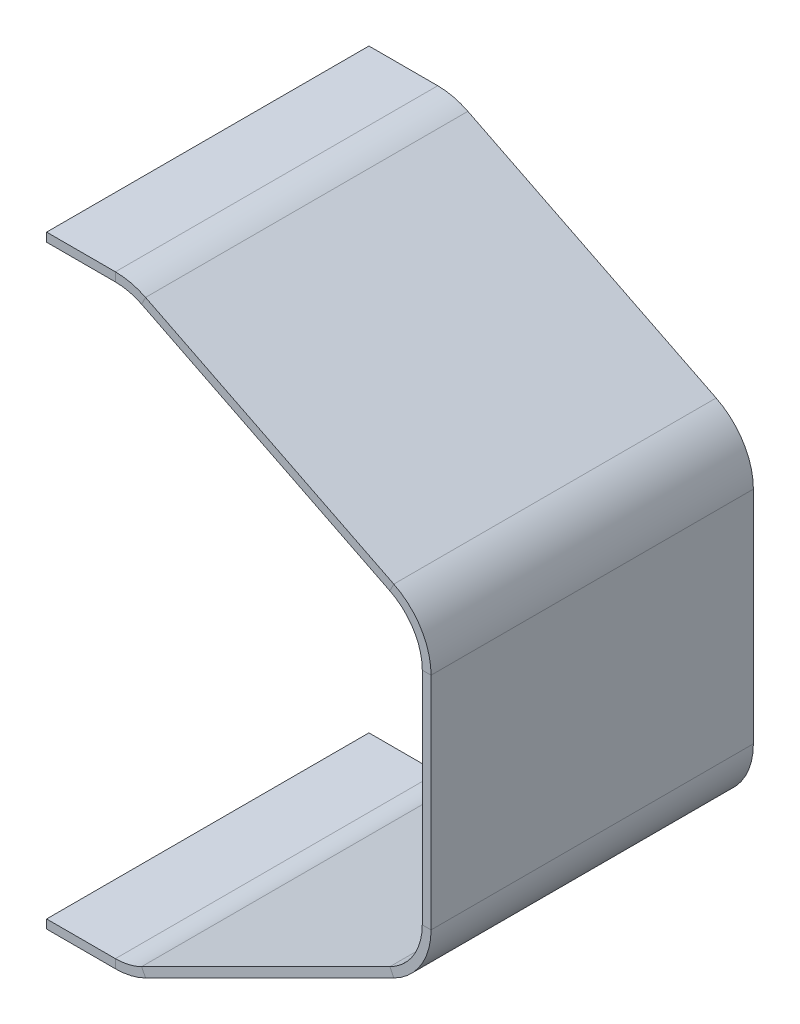
ISO-10303-21;
HEADER;
FILE_DESCRIPTION(('STEP AP214'),'2;1');
FILE_NAME('part.step','',(''),(''),'','','');
FILE_SCHEMA(('AUTOMOTIVE_DESIGN { 1 0 10303 214 1 1 1 1 }'));
ENDSEC;
DATA;
#1=APPLICATION_CONTEXT('core data for automotive mechanical design processes');
#2=APPLICATION_PROTOCOL_DEFINITION('international standard','automotive_design',2000,#1);
#3=PRODUCT_CONTEXT('',#1,'mechanical');
#4=PRODUCT('Part','Part','',(#3));
#5=PRODUCT_RELATED_PRODUCT_CATEGORY('part','',(#4));
#6=PRODUCT_DEFINITION_FORMATION('','',#4);
#7=PRODUCT_DEFINITION_CONTEXT('part definition',#1,'design');
#8=PRODUCT_DEFINITION('design','',#6,#7);
#9=PRODUCT_DEFINITION_SHAPE('','',#8);
#10=(LENGTH_UNIT() NAMED_UNIT(*) SI_UNIT(.MILLI.,.METRE.));
#11=(NAMED_UNIT(*) PLANE_ANGLE_UNIT() SI_UNIT($,.RADIAN.));
#12=(NAMED_UNIT(*) SI_UNIT($,.STERADIAN.) SOLID_ANGLE_UNIT());
#13=UNCERTAINTY_MEASURE_WITH_UNIT(LENGTH_MEASURE(1.E-05),#10,'distance_accuracy_value','');
#14=(GEOMETRIC_REPRESENTATION_CONTEXT(3) GLOBAL_UNCERTAINTY_ASSIGNED_CONTEXT((#13)) GLOBAL_UNIT_ASSIGNED_CONTEXT((#10,
#11,#12)) REPRESENTATION_CONTEXT('',''));
#15=CARTESIAN_POINT('',(0.,0.,0.));
#16=DIRECTION('',(0.,0.,1.));
#17=DIRECTION('',(1.,0.,0.));
#18=AXIS2_PLACEMENT_3D('',#15,#16,#17);
#19=CARTESIAN_POINT('',(16.2114561800017,-48.9442719099992,55.));
#20=DIRECTION('',(0.,0.,1.));
#21=DIRECTION('',(1.,0.,0.));
#22=AXIS2_PLACEMENT_3D('',#19,#20,#21);
#23=PLANE('',#22);
#24=DIRECTION('',(0.447213595499958,-0.894427190999916,0.));
#25=VECTOR('',#24,1.);
#26=CARTESIAN_POINT('',(16.2114561800017,-48.9442719099992,55.));
#27=LINE('',#26,#25);
#28=CARTESIAN_POINT('',(16.2114561800017,-48.9442719099992,55.));
#29=VERTEX_POINT('',#28);
#30=CARTESIAN_POINT('',(16.8822765732516,-50.285912696499,55.));
#31=VERTEX_POINT('',#30);
#32=EDGE_CURVE('E11',#29,#31,#27,.T.);
#33=ORIENTED_EDGE('',*,*,#32,.F.);
#34=CARTESIAN_POINT('',(11.7393202250021,-40.,55.));
#35=DIRECTION('',(0.,0.,1.));
#36=DIRECTION('',(1.,0.,0.));
#37=AXIS2_PLACEMENT_3D('',#34,#35,#36);
#38=CIRCLE('',#37,10.);
#39=CARTESIAN_POINT('',(11.7393202250021,-50.,55.));
#40=VERTEX_POINT('',#39);
#41=EDGE_CURVE('E363',#40,#29,#38,.T.);
#42=ORIENTED_EDGE('',*,*,#41,.F.);
#43=DIRECTION('',(0.,1.,0.));
#44=VECTOR('',#43,1.);
#45=CARTESIAN_POINT('',(11.7393202250021,-51.5,55.));
#46=LINE('',#45,#44);
#47=CARTESIAN_POINT('',(11.7393202250021,-51.5,55.));
#48=VERTEX_POINT('',#47);
#49=EDGE_CURVE('E42',#48,#40,#46,.T.);
#50=ORIENTED_EDGE('',*,*,#49,.F.);
#51=CARTESIAN_POINT('',(11.7393202250021,-40.,55.));
#52=DIRECTION('',(0.,0.,1.));
#53=DIRECTION('',(1.,0.,0.));
#54=AXIS2_PLACEMENT_3D('',#51,#52,#53);
#55=CIRCLE('',#54,11.5);
#56=EDGE_CURVE('E376',#48,#31,#55,.T.);
#57=ORIENTED_EDGE('',*,*,#56,.T.);
#58=EDGE_LOOP('',(#33,#42,#50,#57));
#59=FACE_BOUND('',#58,.T.);
#60=ADVANCED_FACE('F34',(#59),#23,.T.);
#61=CARTESIAN_POINT('',(11.7393202250021,-51.5,55.));
#62=DIRECTION('',(0.,0.,1.));
#63=DIRECTION('',(1.,0.,0.));
#64=AXIS2_PLACEMENT_3D('',#61,#62,#63);
#65=PLANE('',#64);
#66=DIRECTION('',(0.894427190999916,0.447213595499958,0.));
#67=VECTOR('',#66,1.);
#68=CARTESIAN_POINT('',(58.5721359549996,-27.7639320225002,55.));
#69=LINE('',#68,#67);
#70=CARTESIAN_POINT('',(58.5721359549996,-27.7639320225002,55.));
#71=VERTEX_POINT('',#70);
#72=EDGE_CURVE('E367',#29,#71,#69,.T.);
#73=ORIENTED_EDGE('',*,*,#72,.F.);
#74=ORIENTED_EDGE('',*,*,#32,.T.);
#75=DIRECTION('',(0.894427190999916,0.447213595499958,0.));
#76=VECTOR('',#75,1.);
#77=CARTESIAN_POINT('',(59.2429563482495,-29.1055728090001,55.));
#78=LINE('',#77,#76);
#79=CARTESIAN_POINT('',(59.2429563482495,-29.1055728090001,55.));
#80=VERTEX_POINT('',#79);
#81=EDGE_CURVE('E378',#31,#80,#78,.T.);
#82=ORIENTED_EDGE('',*,*,#81,.T.);
#83=DIRECTION('',(-0.447213595499958,0.894427190999916,0.));
#84=VECTOR('',#83,1.);
#85=CARTESIAN_POINT('',(59.2429563482495,-29.1055728090001,55.));
#86=LINE('',#85,#84);
#87=EDGE_CURVE('E337',#80,#71,#86,.T.);
#88=ORIENTED_EDGE('',*,*,#87,.T.);
#89=EDGE_LOOP('',(#73,#74,#82,#88));
#90=FACE_BOUND('',#89,.T.);
#91=ADVANCED_FACE('F447',(#90),#65,.T.);
#92=CARTESIAN_POINT('',(11.7393202250021,-50.,0.));
#93=DIRECTION('',(0.,0.,-1.));
#94=DIRECTION('',(-1.,0.,0.));
#95=AXIS2_PLACEMENT_3D('',#92,#93,#94);
#96=PLANE('',#95);
#97=DIRECTION('',(0.,-1.,0.));
#98=VECTOR('',#97,1.);
#99=CARTESIAN_POINT('',(11.7393202250021,-50.,0.));
#100=LINE('',#99,#98);
#101=CARTESIAN_POINT('',(11.7393202250021,-50.,0.));
#102=VERTEX_POINT('',#101);
#103=CARTESIAN_POINT('',(11.7393202250021,-51.5,0.));
#104=VERTEX_POINT('',#103);
#105=EDGE_CURVE('E343',#102,#104,#100,.T.);
#106=ORIENTED_EDGE('',*,*,#105,.F.);
#107=CARTESIAN_POINT('',(11.7393202250021,-40.,0.));
#108=DIRECTION('',(0.,0.,1.));
#109=DIRECTION('',(1.,0.,0.));
#110=AXIS2_PLACEMENT_3D('',#107,#108,#109);
#111=CIRCLE('',#110,10.);
#112=CARTESIAN_POINT('',(16.2114561800017,-48.9442719099992,0.));
#113=VERTEX_POINT('',#112);
#114=EDGE_CURVE('E247',#102,#113,#111,.T.);
#115=ORIENTED_EDGE('',*,*,#114,.T.);
#116=DIRECTION('',(-0.447213595499958,0.894427190999916,0.));
#117=VECTOR('',#116,1.);
#118=CARTESIAN_POINT('',(16.8822765732516,-50.285912696499,0.));
#119=LINE('',#118,#117);
#120=CARTESIAN_POINT('',(16.8822765732516,-50.285912696499,0.));
#121=VERTEX_POINT('',#120);
#122=EDGE_CURVE('E341',#121,#113,#119,.T.);
#123=ORIENTED_EDGE('',*,*,#122,.F.);
#124=CARTESIAN_POINT('',(11.7393202250021,-40.,0.));
#125=DIRECTION('',(0.,0.,1.));
#126=DIRECTION('',(1.,0.,0.));
#127=AXIS2_PLACEMENT_3D('',#124,#125,#126);
#128=CIRCLE('',#127,11.5);
#129=EDGE_CURVE('E259',#104,#121,#128,.T.);
#130=ORIENTED_EDGE('',*,*,#129,.F.);
#131=EDGE_LOOP('',(#106,#115,#123,#130));
#132=FACE_BOUND('',#131,.T.);
#133=ADVANCED_FACE('F489',(#132),#96,.T.);
#134=CARTESIAN_POINT('',(16.8822765732516,-50.285912696499,0.));
#135=DIRECTION('',(0.,0.,-1.));
#136=DIRECTION('',(-1.,0.,0.));
#137=AXIS2_PLACEMENT_3D('',#134,#135,#136);
#138=PLANE('',#137);
#139=DIRECTION('',(1.,0.,0.));
#140=VECTOR('',#139,1.);
#141=CARTESIAN_POINT('',(11.7393202250021,-50.,0.));
#142=LINE('',#141,#140);
#143=CARTESIAN_POINT('',(0.,-50.,0.));
#144=VERTEX_POINT('',#143);
#145=EDGE_CURVE('E250',#144,#102,#142,.T.);
#146=ORIENTED_EDGE('',*,*,#145,.T.);
#147=ORIENTED_EDGE('',*,*,#105,.T.);
#148=DIRECTION('',(1.,0.,0.));
#149=VECTOR('',#148,1.);
#150=CARTESIAN_POINT('',(11.7393202250021,-51.5,0.));
#151=LINE('',#150,#149);
#152=CARTESIAN_POINT('',(0.,-51.5,0.));
#153=VERTEX_POINT('',#152);
#154=EDGE_CURVE('E256',#153,#104,#151,.T.);
#155=ORIENTED_EDGE('',*,*,#154,.F.);
#156=DIRECTION('',(0.,1.,0.));
#157=VECTOR('',#156,1.);
#158=CARTESIAN_POINT('',(0.,-51.5,0.));
#159=LINE('',#158,#157);
#160=EDGE_CURVE('E253',#153,#144,#159,.T.);
#161=ORIENTED_EDGE('',*,*,#160,.T.);
#162=EDGE_LOOP('',(#146,#147,#155,#161));
#163=FACE_BOUND('',#162,.T.);
#164=ADVANCED_FACE('F493',(#163),#138,.T.);
#165=CARTESIAN_POINT('',(64.1,-18.8196601125011,55.));
#166=DIRECTION('',(0.,0.,1.));
#167=DIRECTION('',(1.,0.,0.));
#168=AXIS2_PLACEMENT_3D('',#165,#166,#167);
#169=PLANE('',#168);
#170=DIRECTION('',(1.,0.,0.));
#171=VECTOR('',#170,1.);
#172=CARTESIAN_POINT('',(64.1,-18.8196601125011,55.));
#173=LINE('',#172,#171);
#174=CARTESIAN_POINT('',(64.1,-18.8196601125011,55.));
#175=VERTEX_POINT('',#174);
#176=CARTESIAN_POINT('',(65.6,-18.8196601125011,55.));
#177=VERTEX_POINT('',#176);
#178=EDGE_CURVE('E339',#175,#177,#173,.T.);
#179=ORIENTED_EDGE('',*,*,#178,.F.);
#180=CARTESIAN_POINT('',(54.1,-18.8196601125011,55.));
#181=DIRECTION('',(0.,0.,1.));
#182=DIRECTION('',(1.,0.,0.));
#183=AXIS2_PLACEMENT_3D('',#180,#181,#182);
#184=CIRCLE('',#183,10.);
#185=EDGE_CURVE('E437',#71,#175,#184,.T.);
#186=ORIENTED_EDGE('',*,*,#185,.F.);
#187=ORIENTED_EDGE('',*,*,#87,.F.);
#188=CARTESIAN_POINT('',(54.1,-18.8196601125011,55.));
#189=DIRECTION('',(0.,0.,1.));
#190=DIRECTION('',(1.,0.,0.));
#191=AXIS2_PLACEMENT_3D('',#188,#189,#190);
#192=CIRCLE('',#191,11.5);
#193=EDGE_CURVE('E381',#80,#177,#192,.T.);
#194=ORIENTED_EDGE('',*,*,#193,.T.);
#195=EDGE_LOOP('',(#179,#186,#187,#194));
#196=FACE_BOUND('',#195,.T.);
#197=ADVANCED_FACE('F454',(#196),#169,.T.);
#198=CARTESIAN_POINT('',(59.2429563482495,-29.1055728090001,55.));
#199=DIRECTION('',(0.,0.,1.));
#200=DIRECTION('',(1.,0.,0.));
#201=AXIS2_PLACEMENT_3D('',#198,#199,#200);
#202=PLANE('',#201);
#203=DIRECTION('',(0.,1.,0.));
#204=VECTOR('',#203,1.);
#205=CARTESIAN_POINT('',(64.1,-18.8196601125011,55.));
#206=LINE('',#205,#204);
#207=CARTESIAN_POINT('',(64.1,18.8196601125011,55.));
#208=VERTEX_POINT('',#207);
#209=EDGE_CURVE('E434',#175,#208,#206,.T.);
#210=ORIENTED_EDGE('',*,*,#209,.F.);
#211=ORIENTED_EDGE('',*,*,#178,.T.);
#212=DIRECTION('',(0.,1.,0.));
#213=VECTOR('',#212,1.);
#214=CARTESIAN_POINT('',(65.6,-18.8196601125011,55.));
#215=LINE('',#214,#213);
#216=CARTESIAN_POINT('',(65.6,18.8196601125011,55.));
#217=VERTEX_POINT('',#216);
#218=EDGE_CURVE('E201',#177,#217,#215,.T.);
#219=ORIENTED_EDGE('',*,*,#218,.T.);
#220=DIRECTION('',(-1.,0.,0.));
#221=VECTOR('',#220,1.);
#222=CARTESIAN_POINT('',(65.6,18.8196601125011,55.));
#223=LINE('',#222,#221);
#224=EDGE_CURVE('E192',#217,#208,#223,.T.);
#225=ORIENTED_EDGE('',*,*,#224,.T.);
#226=EDGE_LOOP('',(#210,#211,#219,#225));
#227=FACE_BOUND('',#226,.T.);
#228=ADVANCED_FACE('F387',(#227),#202,.T.);
#229=CARTESIAN_POINT('',(58.5721359549996,-27.7639320225002,0.));
#230=DIRECTION('',(0.,0.,-1.));
#231=DIRECTION('',(-1.,0.,0.));
#232=AXIS2_PLACEMENT_3D('',#229,#230,#231);
#233=PLANE('',#232);
#234=DIRECTION('',(0.447213595499958,-0.894427190999916,0.));
#235=VECTOR('',#234,1.);
#236=CARTESIAN_POINT('',(58.5721359549996,-27.7639320225002,0.));
#237=LINE('',#236,#235);
#238=CARTESIAN_POINT('',(58.5721359549996,-27.7639320225002,0.));
#239=VERTEX_POINT('',#238);
#240=CARTESIAN_POINT('',(59.2429563482495,-29.1055728090001,0.));
#241=VERTEX_POINT('',#240);
#242=EDGE_CURVE('E335',#239,#241,#237,.T.);
#243=ORIENTED_EDGE('',*,*,#242,.F.);
#244=CARTESIAN_POINT('',(54.1,-18.8196601125011,0.));
#245=DIRECTION('',(0.,0.,1.));
#246=DIRECTION('',(1.,0.,0.));
#247=AXIS2_PLACEMENT_3D('',#244,#245,#246);
#248=CIRCLE('',#247,10.);
#249=CARTESIAN_POINT('',(64.1,-18.8196601125011,0.));
#250=VERTEX_POINT('',#249);
#251=EDGE_CURVE('E241',#239,#250,#248,.T.);
#252=ORIENTED_EDGE('',*,*,#251,.T.);
#253=DIRECTION('',(-1.,0.,0.));
#254=VECTOR('',#253,1.);
#255=CARTESIAN_POINT('',(65.6,-18.8196601125011,0.));
#256=LINE('',#255,#254);
#257=CARTESIAN_POINT('',(65.6,-18.8196601125011,0.));
#258=VERTEX_POINT('',#257);
#259=EDGE_CURVE('E191',#258,#250,#256,.T.);
#260=ORIENTED_EDGE('',*,*,#259,.F.);
#261=CARTESIAN_POINT('',(54.1,-18.8196601125011,0.));
#262=DIRECTION('',(0.,0.,1.));
#263=DIRECTION('',(1.,0.,0.));
#264=AXIS2_PLACEMENT_3D('',#261,#262,#263);
#265=CIRCLE('',#264,11.5);
#266=EDGE_CURVE('E265',#241,#258,#265,.T.);
#267=ORIENTED_EDGE('',*,*,#266,.F.);
#268=EDGE_LOOP('',(#243,#252,#260,#267));
#269=FACE_BOUND('',#268,.T.);
#270=ADVANCED_FACE('F463',(#269),#233,.T.);
#271=CARTESIAN_POINT('',(65.6,-18.8196601125011,0.));
#272=DIRECTION('',(0.,0.,-1.));
#273=DIRECTION('',(-1.,0.,0.));
#274=AXIS2_PLACEMENT_3D('',#271,#272,#273);
#275=PLANE('',#274);
#276=DIRECTION('',(0.894427190999916,0.447213595499958,0.));
#277=VECTOR('',#276,1.);
#278=CARTESIAN_POINT('',(58.5721359549996,-27.7639320225002,0.));
#279=LINE('',#278,#277);
#280=EDGE_CURVE('E244',#113,#239,#279,.T.);
#281=ORIENTED_EDGE('',*,*,#280,.T.);
#282=ORIENTED_EDGE('',*,*,#242,.T.);
#283=DIRECTION('',(0.894427190999916,0.447213595499958,0.));
#284=VECTOR('',#283,1.);
#285=CARTESIAN_POINT('',(59.2429563482495,-29.1055728090001,0.));
#286=LINE('',#285,#284);
#287=EDGE_CURVE('E262',#121,#241,#286,.T.);
#288=ORIENTED_EDGE('',*,*,#287,.F.);
#289=ORIENTED_EDGE('',*,*,#122,.T.);
#290=EDGE_LOOP('',(#281,#282,#288,#289));
#291=FACE_BOUND('',#290,.T.);
#292=ADVANCED_FACE('F467',(#291),#275,.T.);
#293=CARTESIAN_POINT('',(58.5721359549996,27.7639320225002,55.));
#294=DIRECTION('',(0.,0.,1.));
#295=DIRECTION('',(1.,0.,0.));
#296=AXIS2_PLACEMENT_3D('',#293,#294,#295);
#297=PLANE('',#296);
#298=DIRECTION('',(0.447213595499956,0.894427190999917,0.));
#299=VECTOR('',#298,1.);
#300=CARTESIAN_POINT('',(58.5721359549996,27.7639320225002,55.));
#301=LINE('',#300,#299);
#302=CARTESIAN_POINT('',(58.5721359549996,27.7639320225002,55.));
#303=VERTEX_POINT('',#302);
#304=CARTESIAN_POINT('',(59.2429563482495,29.1055728090001,55.));
#305=VERTEX_POINT('',#304);
#306=EDGE_CURVE('E179',#303,#305,#301,.T.);
#307=ORIENTED_EDGE('',*,*,#306,.F.);
#308=CARTESIAN_POINT('',(54.1,18.8196601125011,55.));
#309=DIRECTION('',(0.,0.,1.));
#310=DIRECTION('',(1.,0.,0.));
#311=AXIS2_PLACEMENT_3D('',#308,#309,#310);
#312=CIRCLE('',#311,10.);
#313=EDGE_CURVE('E399',#208,#303,#312,.T.);
#314=ORIENTED_EDGE('',*,*,#313,.F.);
#315=ORIENTED_EDGE('',*,*,#224,.F.);
#316=CARTESIAN_POINT('',(54.1,18.8196601125011,55.));
#317=DIRECTION('',(0.,0.,1.));
#318=DIRECTION('',(1.,0.,0.));
#319=AXIS2_PLACEMENT_3D('',#316,#317,#318);
#320=CIRCLE('',#319,11.5);
#321=EDGE_CURVE('E195',#217,#305,#320,.T.);
#322=ORIENTED_EDGE('',*,*,#321,.T.);
#323=EDGE_LOOP('',(#307,#314,#315,#322));
#324=FACE_BOUND('',#323,.T.);
#325=ADVANCED_FACE('F197',(#324),#297,.T.);
#326=CARTESIAN_POINT('',(65.6,18.8196601125011,55.));
#327=DIRECTION('',(0.,0.,1.));
#328=DIRECTION('',(1.,0.,0.));
#329=AXIS2_PLACEMENT_3D('',#326,#327,#328);
#330=PLANE('',#329);
#331=DIRECTION('',(-0.894427190999916,0.447213595499958,0.));
#332=VECTOR('',#331,1.);
#333=CARTESIAN_POINT('',(58.5721359549996,27.7639320225002,55.));
#334=LINE('',#333,#332);
#335=CARTESIAN_POINT('',(16.2114561800017,48.9442719099992,55.));
#336=VERTEX_POINT('',#335);
#337=EDGE_CURVE('E186',#303,#336,#334,.T.);
#338=ORIENTED_EDGE('',*,*,#337,.F.);
#339=ORIENTED_EDGE('',*,*,#306,.T.);
#340=DIRECTION('',(-0.894427190999916,0.447213595499958,0.));
#341=VECTOR('',#340,1.);
#342=CARTESIAN_POINT('',(59.2429563482495,29.1055728090001,55.));
#343=LINE('',#342,#341);
#344=CARTESIAN_POINT('',(16.8822765732516,50.285912696499,55.));
#345=VERTEX_POINT('',#344);
#346=EDGE_CURVE('E183',#305,#345,#343,.T.);
#347=ORIENTED_EDGE('',*,*,#346,.T.);
#348=DIRECTION('',(-0.44721359549996,-0.894427190999915,0.));
#349=VECTOR('',#348,1.);
#350=CARTESIAN_POINT('',(16.8822765732516,50.285912696499,55.));
#351=LINE('',#350,#349);
#352=EDGE_CURVE('E326',#345,#336,#351,.T.);
#353=ORIENTED_EDGE('',*,*,#352,.T.);
#354=EDGE_LOOP('',(#338,#339,#347,#353));
#355=FACE_BOUND('',#354,.T.);
#356=ADVANCED_FACE('F181',(#355),#330,.T.);
#357=CARTESIAN_POINT('',(64.1,18.8196601125011,0.));
#358=DIRECTION('',(0.,0.,-1.));
#359=DIRECTION('',(-1.,0.,0.));
#360=AXIS2_PLACEMENT_3D('',#357,#358,#359);
#361=PLANE('',#360);
#362=DIRECTION('',(1.,0.,0.));
#363=VECTOR('',#362,1.);
#364=CARTESIAN_POINT('',(64.1,18.8196601125011,0.));
#365=LINE('',#364,#363);
#366=CARTESIAN_POINT('',(64.1,18.8196601125011,0.));
#367=VERTEX_POINT('',#366);
#368=CARTESIAN_POINT('',(65.6,18.8196601125011,0.));
#369=VERTEX_POINT('',#368);
#370=EDGE_CURVE('E331',#367,#369,#365,.T.);
#371=ORIENTED_EDGE('',*,*,#370,.F.);
#372=CARTESIAN_POINT('',(54.1,18.8196601125011,0.));
#373=DIRECTION('',(0.,0.,1.));
#374=DIRECTION('',(1.,0.,0.));
#375=AXIS2_PLACEMENT_3D('',#372,#373,#374);
#376=CIRCLE('',#375,10.);
#377=CARTESIAN_POINT('',(58.5721359549996,27.7639320225002,0.));
#378=VERTEX_POINT('',#377);
#379=EDGE_CURVE('E235',#367,#378,#376,.T.);
#380=ORIENTED_EDGE('',*,*,#379,.T.);
#381=DIRECTION('',(-0.447213595499956,-0.894427190999917,0.));
#382=VECTOR('',#381,1.);
#383=CARTESIAN_POINT('',(59.2429563482495,29.1055728090001,0.));
#384=LINE('',#383,#382);
#385=CARTESIAN_POINT('',(59.2429563482495,29.1055728090001,0.));
#386=VERTEX_POINT('',#385);
#387=EDGE_CURVE('E329',#386,#378,#384,.T.);
#388=ORIENTED_EDGE('',*,*,#387,.F.);
#389=CARTESIAN_POINT('',(54.1,18.8196601125011,0.));
#390=DIRECTION('',(0.,0.,1.));
#391=DIRECTION('',(1.,0.,0.));
#392=AXIS2_PLACEMENT_3D('',#389,#390,#391);
#393=CIRCLE('',#392,11.5);
#394=EDGE_CURVE('E208',#369,#386,#393,.T.);
#395=ORIENTED_EDGE('',*,*,#394,.F.);
#396=EDGE_LOOP('',(#371,#380,#388,#395));
#397=FACE_BOUND('',#396,.T.);
#398=ADVANCED_FACE('F393',(#397),#361,.T.);
#399=CARTESIAN_POINT('',(59.2429563482495,29.1055728090001,0.));
#400=DIRECTION('',(0.,0.,-1.));
#401=DIRECTION('',(-1.,0.,0.));
#402=AXIS2_PLACEMENT_3D('',#399,#400,#401);
#403=PLANE('',#402);
#404=DIRECTION('',(0.,1.,0.));
#405=VECTOR('',#404,1.);
#406=CARTESIAN_POINT('',(64.1,-18.8196601125011,0.));
#407=LINE('',#406,#405);
#408=EDGE_CURVE('E238',#250,#367,#407,.T.);
#409=ORIENTED_EDGE('',*,*,#408,.T.);
#410=ORIENTED_EDGE('',*,*,#370,.T.);
#411=DIRECTION('',(0.,1.,0.));
#412=VECTOR('',#411,1.);
#413=CARTESIAN_POINT('',(65.6,-18.8196601125011,0.));
#414=LINE('',#413,#412);
#415=EDGE_CURVE('E268',#258,#369,#414,.T.);
#416=ORIENTED_EDGE('',*,*,#415,.F.);
#417=ORIENTED_EDGE('',*,*,#259,.T.);
#418=EDGE_LOOP('',(#409,#410,#416,#417));
#419=FACE_BOUND('',#418,.T.);
#420=ADVANCED_FACE('F473',(#419),#403,.T.);
#421=CARTESIAN_POINT('',(11.7393202250021,50.,55.));
#422=DIRECTION('',(0.,0.,1.));
#423=DIRECTION('',(1.,0.,0.));
#424=AXIS2_PLACEMENT_3D('',#421,#422,#423);
#425=PLANE('',#424);
#426=DIRECTION('',(0.,1.,0.));
#427=VECTOR('',#426,1.);
#428=CARTESIAN_POINT('',(11.7393202250021,50.,55.));
#429=LINE('',#428,#427);
#430=CARTESIAN_POINT('',(11.7393202250021,50.,55.));
#431=VERTEX_POINT('',#430);
#432=CARTESIAN_POINT('',(11.7393202250021,51.5,55.));
#433=VERTEX_POINT('',#432);
#434=EDGE_CURVE('E50',#431,#433,#429,.T.);
#435=ORIENTED_EDGE('',*,*,#434,.F.);
#436=CARTESIAN_POINT('',(11.7393202250021,40.,55.));
#437=DIRECTION('',(0.,0.,1.));
#438=DIRECTION('',(1.,0.,0.));
#439=AXIS2_PLACEMENT_3D('',#436,#437,#438);
#440=CIRCLE('',#439,10.);
#441=EDGE_CURVE('E427',#336,#431,#440,.T.);
#442=ORIENTED_EDGE('',*,*,#441,.F.);
#443=ORIENTED_EDGE('',*,*,#352,.F.);
#444=CARTESIAN_POINT('',(11.7393202250021,40.,55.));
#445=DIRECTION('',(0.,0.,1.));
#446=DIRECTION('',(1.,0.,0.));
#447=AXIS2_PLACEMENT_3D('',#444,#445,#446);
#448=CIRCLE('',#447,11.5);
#449=EDGE_CURVE('E216',#345,#433,#448,.T.);
#450=ORIENTED_EDGE('',*,*,#449,.T.);
#451=EDGE_LOOP('',(#435,#442,#443,#450));
#452=FACE_BOUND('',#451,.T.);
#453=ADVANCED_FACE('F475',(#452),#425,.T.);
#454=CARTESIAN_POINT('',(16.8822765732516,50.285912696499,55.));
#455=DIRECTION('',(0.,0.,1.));
#456=DIRECTION('',(1.,0.,0.));
#457=AXIS2_PLACEMENT_3D('',#454,#455,#456);
#458=PLANE('',#457);
#459=DIRECTION('',(-1.,0.,0.));
#460=VECTOR('',#459,1.);
#461=CARTESIAN_POINT('',(11.7393202250021,50.,55.));
#462=LINE('',#461,#460);
#463=CARTESIAN_POINT('',(0.,50.,55.));
#464=VERTEX_POINT('',#463);
#465=EDGE_CURVE('E425',#431,#464,#462,.T.);
#466=ORIENTED_EDGE('',*,*,#465,.F.);
#467=ORIENTED_EDGE('',*,*,#434,.T.);
#468=DIRECTION('',(1.,0.,0.));
#469=VECTOR('',#468,1.);
#470=CARTESIAN_POINT('',(11.7393202250021,51.5,55.));
#471=LINE('',#470,#469);
#472=CARTESIAN_POINT('',(0.,51.5,55.));
#473=VERTEX_POINT('',#472);
#474=EDGE_CURVE('E128',#433,#473,#471,.F.);
#475=ORIENTED_EDGE('',*,*,#474,.T.);
#476=DIRECTION('',(0.,1.,0.));
#477=VECTOR('',#476,1.);
#478=CARTESIAN_POINT('',(0.,50.,55.));
#479=LINE('',#478,#477);
#480=EDGE_CURVE('E423',#464,#473,#479,.T.);
#481=ORIENTED_EDGE('',*,*,#480,.F.);
#482=EDGE_LOOP('',(#466,#467,#475,#481));
#483=FACE_BOUND('',#482,.T.);
#484=ADVANCED_FACE('F481',(#483),#458,.T.);
#485=CARTESIAN_POINT('',(16.2114561800017,48.9442719099992,0.));
#486=DIRECTION('',(0.,0.,-1.));
#487=DIRECTION('',(-1.,0.,0.));
#488=AXIS2_PLACEMENT_3D('',#485,#486,#487);
#489=PLANE('',#488);
#490=DIRECTION('',(0.44721359549996,0.894427190999915,0.));
#491=VECTOR('',#490,1.);
#492=CARTESIAN_POINT('',(16.2114561800017,48.9442719099992,0.));
#493=LINE('',#492,#491);
#494=CARTESIAN_POINT('',(16.2114561800017,48.9442719099992,0.));
#495=VERTEX_POINT('',#494);
#496=CARTESIAN_POINT('',(16.8822765732516,50.285912696499,0.));
#497=VERTEX_POINT('',#496);
#498=EDGE_CURVE('E115',#495,#497,#493,.T.);
#499=ORIENTED_EDGE('',*,*,#498,.F.);
#500=CARTESIAN_POINT('',(11.7393202250021,40.,0.));
#501=DIRECTION('',(0.,0.,1.));
#502=DIRECTION('',(1.,0.,0.));
#503=AXIS2_PLACEMENT_3D('',#500,#501,#502);
#504=CIRCLE('',#503,10.);
#505=CARTESIAN_POINT('',(11.7393202250021,50.,0.));
#506=VERTEX_POINT('',#505);
#507=EDGE_CURVE('E231',#495,#506,#504,.T.);
#508=ORIENTED_EDGE('',*,*,#507,.T.);
#509=DIRECTION('',(0.,-1.,0.));
#510=VECTOR('',#509,1.);
#511=CARTESIAN_POINT('',(11.7393202250021,51.5,0.));
#512=LINE('',#511,#510);
#513=CARTESIAN_POINT('',(11.7393202250021,51.5,0.));
#514=VERTEX_POINT('',#513);
#515=EDGE_CURVE('E122',#514,#506,#512,.T.);
#516=ORIENTED_EDGE('',*,*,#515,.F.);
#517=CARTESIAN_POINT('',(11.7393202250021,40.,0.));
#518=DIRECTION('',(0.,0.,1.));
#519=DIRECTION('',(1.,0.,0.));
#520=AXIS2_PLACEMENT_3D('',#517,#518,#519);
#521=CIRCLE('',#520,11.5);
#522=EDGE_CURVE('E274',#497,#514,#521,.T.);
#523=ORIENTED_EDGE('',*,*,#522,.F.);
#524=EDGE_LOOP('',(#499,#508,#516,#523));
#525=FACE_BOUND('',#524,.T.);
#526=ADVANCED_FACE('F410',(#525),#489,.T.);
#527=CARTESIAN_POINT('',(11.7393202250021,51.5,0.));
#528=DIRECTION('',(0.,0.,-1.));
#529=DIRECTION('',(-1.,0.,0.));
#530=AXIS2_PLACEMENT_3D('',#527,#528,#529);
#531=PLANE('',#530);
#532=DIRECTION('',(-0.894427190999916,0.447213595499958,0.));
#533=VECTOR('',#532,1.);
#534=CARTESIAN_POINT('',(58.5721359549996,27.7639320225002,0.));
#535=LINE('',#534,#533);
#536=EDGE_CURVE('E233',#378,#495,#535,.T.);
#537=ORIENTED_EDGE('',*,*,#536,.T.);
#538=ORIENTED_EDGE('',*,*,#498,.T.);
#539=DIRECTION('',(-0.894427190999916,0.447213595499958,0.));
#540=VECTOR('',#539,1.);
#541=CARTESIAN_POINT('',(59.2429563482495,29.1055728090001,0.));
#542=LINE('',#541,#540);
#543=EDGE_CURVE('E272',#386,#497,#542,.T.);
#544=ORIENTED_EDGE('',*,*,#543,.F.);
#545=ORIENTED_EDGE('',*,*,#387,.T.);
#546=EDGE_LOOP('',(#537,#538,#544,#545));
#547=FACE_BOUND('',#546,.T.);
#548=ADVANCED_FACE('F395',(#547),#531,.T.);
#549=CARTESIAN_POINT('',(11.7393202250021,51.5,55.));
#550=DIRECTION('',(0.,-1.,0.));
#551=DIRECTION('',(0.,0.,-1.));
#552=AXIS2_PLACEMENT_3D('',#549,#550,#551);
#553=PLANE('',#552);
#554=DIRECTION('',(1.,0.,0.));
#555=VECTOR('',#554,1.);
#556=CARTESIAN_POINT('',(11.7393202250021,51.5,0.));
#557=LINE('',#556,#555);
#558=CARTESIAN_POINT('',(0.,51.5,0.));
#559=VERTEX_POINT('',#558);
#560=EDGE_CURVE('E222',#514,#559,#557,.F.);
#561=ORIENTED_EDGE('',*,*,#560,.T.);
#562=DIRECTION('',(0.,0.,-1.));
#563=VECTOR('',#562,1.);
#564=CARTESIAN_POINT('',(0.,51.5,55.));
#565=LINE('',#564,#563);
#566=EDGE_CURVE('E322',#473,#559,#565,.T.);
#567=ORIENTED_EDGE('',*,*,#566,.F.);
#568=ORIENTED_EDGE('',*,*,#474,.F.);
#569=DIRECTION('',(0.,0.,-1.));
#570=VECTOR('',#569,1.);
#571=CARTESIAN_POINT('',(11.7393202250021,51.5,55.));
#572=LINE('',#571,#570);
#573=EDGE_CURVE('E218',#433,#514,#572,.T.);
#574=ORIENTED_EDGE('',*,*,#573,.T.);
#575=EDGE_LOOP('',(#561,#567,#568,#574));
#576=FACE_BOUND('',#575,.T.);
#577=ADVANCED_FACE('F416',(#576),#553,.F.);
#578=CARTESIAN_POINT('',(0.,50.,55.));
#579=DIRECTION('',(-1.,0.,0.));
#580=DIRECTION('',(0.,-1.,0.));
#581=AXIS2_PLACEMENT_3D('',#578,#579,#580);
#582=PLANE('',#581);
#583=DIRECTION('',(0.,1.,0.));
#584=VECTOR('',#583,1.);
#585=CARTESIAN_POINT('',(0.,50.,0.));
#586=LINE('',#585,#584);
#587=CARTESIAN_POINT('',(0.,50.,0.));
#588=VERTEX_POINT('',#587);
#589=EDGE_CURVE('E225',#588,#559,#586,.T.);
#590=ORIENTED_EDGE('',*,*,#589,.F.);
#591=DIRECTION('',(0.,0.,-1.));
#592=VECTOR('',#591,1.);
#593=CARTESIAN_POINT('',(0.,50.,55.));
#594=LINE('',#593,#592);
#595=EDGE_CURVE('E320',#464,#588,#594,.T.);
#596=ORIENTED_EDGE('',*,*,#595,.F.);
#597=ORIENTED_EDGE('',*,*,#480,.T.);
#598=ORIENTED_EDGE('',*,*,#566,.T.);
#599=EDGE_LOOP('',(#590,#596,#597,#598));
#600=FACE_BOUND('',#599,.T.);
#601=ADVANCED_FACE('F421',(#600),#582,.T.);
#602=CARTESIAN_POINT('',(11.7393202250021,50.,55.));
#603=DIRECTION('',(0.,-1.,0.));
#604=DIRECTION('',(0.,0.,-1.));
#605=AXIS2_PLACEMENT_3D('',#602,#603,#604);
#606=PLANE('',#605);
#607=DIRECTION('',(-1.,0.,0.));
#608=VECTOR('',#607,1.);
#609=CARTESIAN_POINT('',(11.7393202250021,50.,0.));
#610=LINE('',#609,#608);
#611=EDGE_CURVE('E228',#506,#588,#610,.T.);
#612=ORIENTED_EDGE('',*,*,#611,.F.);
#613=DIRECTION('',(0.,0.,-1.));
#614=VECTOR('',#613,1.);
#615=CARTESIAN_POINT('',(11.7393202250021,50.,55.));
#616=LINE('',#615,#614);
#617=EDGE_CURVE('E317',#431,#506,#616,.T.);
#618=ORIENTED_EDGE('',*,*,#617,.F.);
#619=ORIENTED_EDGE('',*,*,#465,.T.);
#620=ORIENTED_EDGE('',*,*,#595,.T.);
#621=EDGE_LOOP('',(#612,#618,#619,#620));
#622=FACE_BOUND('',#621,.T.);
#623=ADVANCED_FACE('F577',(#622),#606,.T.);
#624=CARTESIAN_POINT('',(11.7393202250021,40.,55.));
#625=DIRECTION('',(0.,0.,-1.));
#626=DIRECTION('',(-1.,0.,0.));
#627=AXIS2_PLACEMENT_3D('',#624,#625,#626);
#628=CYLINDRICAL_SURFACE('',#627,10.);
#629=ORIENTED_EDGE('',*,*,#507,.F.);
#630=DIRECTION('',(0.,0.,-1.));
#631=VECTOR('',#630,1.);
#632=CARTESIAN_POINT('',(16.2114561800017,48.9442719099992,55.));
#633=LINE('',#632,#631);
#634=EDGE_CURVE('E314',#336,#495,#633,.T.);
#635=ORIENTED_EDGE('',*,*,#634,.F.);
#636=ORIENTED_EDGE('',*,*,#441,.T.);
#637=ORIENTED_EDGE('',*,*,#617,.T.);
#638=EDGE_LOOP('',(#629,#635,#636,#637));
#639=FACE_BOUND('',#638,.T.);
#640=ADVANCED_FACE('F407',(#639),#628,.F.);
#641=CARTESIAN_POINT('',(58.5721359549996,27.7639320225002,55.));
#642=DIRECTION('',(-0.447213595499958,-0.894427190999916,0.));
#643=DIRECTION('',(0.894427190999916,-0.447213595499958,0.));
#644=AXIS2_PLACEMENT_3D('',#641,#642,#643);
#645=PLANE('',#644);
#646=ORIENTED_EDGE('',*,*,#536,.F.);
#647=DIRECTION('',(0.,0.,-1.));
#648=VECTOR('',#647,1.);
#649=CARTESIAN_POINT('',(58.5721359549996,27.7639320225002,55.));
#650=LINE('',#649,#648);
#651=EDGE_CURVE('E311',#303,#378,#650,.T.);
#652=ORIENTED_EDGE('',*,*,#651,.F.);
#653=ORIENTED_EDGE('',*,*,#337,.T.);
#654=ORIENTED_EDGE('',*,*,#634,.T.);
#655=EDGE_LOOP('',(#646,#652,#653,#654));
#656=FACE_BOUND('',#655,.T.);
#657=ADVANCED_FACE('F401',(#656),#645,.T.);
#658=CARTESIAN_POINT('',(54.1,18.8196601125011,55.));
#659=DIRECTION('',(0.,0.,-1.));
#660=DIRECTION('',(-1.,0.,0.));
#661=AXIS2_PLACEMENT_3D('',#658,#659,#660);
#662=CYLINDRICAL_SURFACE('',#661,10.);
#663=ORIENTED_EDGE('',*,*,#379,.F.);
#664=DIRECTION('',(0.,0.,-1.));
#665=VECTOR('',#664,1.);
#666=CARTESIAN_POINT('',(64.1,18.8196601125011,55.));
#667=LINE('',#666,#665);
#668=EDGE_CURVE('E308',#208,#367,#667,.T.);
#669=ORIENTED_EDGE('',*,*,#668,.F.);
#670=ORIENTED_EDGE('',*,*,#313,.T.);
#671=ORIENTED_EDGE('',*,*,#651,.T.);
#672=EDGE_LOOP('',(#663,#669,#670,#671));
#673=FACE_BOUND('',#672,.T.);
#674=ADVANCED_FACE('F398',(#673),#662,.F.);
#675=CARTESIAN_POINT('',(64.1,-18.8196601125011,55.));
#676=DIRECTION('',(-1.,0.,0.));
#677=DIRECTION('',(0.,0.,1.));
#678=AXIS2_PLACEMENT_3D('',#675,#676,#677);
#679=PLANE('',#678);
#680=ORIENTED_EDGE('',*,*,#408,.F.);
#681=DIRECTION('',(0.,0.,-1.));
#682=VECTOR('',#681,1.);
#683=CARTESIAN_POINT('',(64.1,-18.8196601125011,55.));
#684=LINE('',#683,#682);
#685=EDGE_CURVE('E305',#175,#250,#684,.T.);
#686=ORIENTED_EDGE('',*,*,#685,.F.);
#687=ORIENTED_EDGE('',*,*,#209,.T.);
#688=ORIENTED_EDGE('',*,*,#668,.T.);
#689=EDGE_LOOP('',(#680,#686,#687,#688));
#690=FACE_BOUND('',#689,.T.);
#691=ADVANCED_FACE('F460',(#690),#679,.T.);
#692=CARTESIAN_POINT('',(54.1,-18.8196601125011,55.));
#693=DIRECTION('',(0.,0.,-1.));
#694=DIRECTION('',(-1.,0.,0.));
#695=AXIS2_PLACEMENT_3D('',#692,#693,#694);
#696=CYLINDRICAL_SURFACE('',#695,10.);
#697=ORIENTED_EDGE('',*,*,#251,.F.);
#698=DIRECTION('',(0.,0.,-1.));
#699=VECTOR('',#698,1.);
#700=CARTESIAN_POINT('',(58.5721359549996,-27.7639320225002,55.));
#701=LINE('',#700,#699);
#702=EDGE_CURVE('E302',#71,#239,#701,.T.);
#703=ORIENTED_EDGE('',*,*,#702,.F.);
#704=ORIENTED_EDGE('',*,*,#185,.T.);
#705=ORIENTED_EDGE('',*,*,#685,.T.);
#706=EDGE_LOOP('',(#697,#703,#704,#705));
#707=FACE_BOUND('',#706,.T.);
#708=ADVANCED_FACE('F453',(#707),#696,.F.);
#709=CARTESIAN_POINT('',(58.5721359549996,-27.7639320225002,55.));
#710=DIRECTION('',(-0.447213595499958,0.894427190999916,0.));
#711=DIRECTION('',(-0.894427190999916,-0.447213595499958,0.));
#712=AXIS2_PLACEMENT_3D('',#709,#710,#711);
#713=PLANE('',#712);
#714=ORIENTED_EDGE('',*,*,#280,.F.);
#715=DIRECTION('',(0.,0.,-1.));
#716=VECTOR('',#715,1.);
#717=CARTESIAN_POINT('',(16.2114561800017,-48.9442719099992,55.));
#718=LINE('',#717,#716);
#719=EDGE_CURVE('E299',#29,#113,#718,.T.);
#720=ORIENTED_EDGE('',*,*,#719,.F.);
#721=ORIENTED_EDGE('',*,*,#72,.T.);
#722=ORIENTED_EDGE('',*,*,#702,.T.);
#723=EDGE_LOOP('',(#714,#720,#721,#722));
#724=FACE_BOUND('',#723,.T.);
#725=ADVANCED_FACE('F443',(#724),#713,.T.);
#726=CARTESIAN_POINT('',(11.7393202250021,-40.,55.));
#727=DIRECTION('',(0.,0.,-1.));
#728=DIRECTION('',(-1.,0.,0.));
#729=AXIS2_PLACEMENT_3D('',#726,#727,#728);
#730=CYLINDRICAL_SURFACE('',#729,10.);
#731=ORIENTED_EDGE('',*,*,#114,.F.);
#732=DIRECTION('',(0.,0.,-1.));
#733=VECTOR('',#732,1.);
#734=CARTESIAN_POINT('',(11.7393202250021,-50.,55.));
#735=LINE('',#734,#733);
#736=EDGE_CURVE('E296',#40,#102,#735,.T.);
#737=ORIENTED_EDGE('',*,*,#736,.F.);
#738=ORIENTED_EDGE('',*,*,#41,.T.);
#739=ORIENTED_EDGE('',*,*,#719,.T.);
#740=EDGE_LOOP('',(#731,#737,#738,#739));
#741=FACE_BOUND('',#740,.T.);
#742=ADVANCED_FACE('F362',(#741),#730,.F.);
#743=CARTESIAN_POINT('',(11.7393202250021,-50.,55.));
#744=DIRECTION('',(0.,1.,0.));
#745=DIRECTION('',(0.,0.,1.));
#746=AXIS2_PLACEMENT_3D('',#743,#744,#745);
#747=PLANE('',#746);
#748=ORIENTED_EDGE('',*,*,#145,.F.);
#749=DIRECTION('',(0.,0.,-1.));
#750=VECTOR('',#749,1.);
#751=CARTESIAN_POINT('',(0.,-50.,55.));
#752=LINE('',#751,#750);
#753=CARTESIAN_POINT('',(0.,-50.,55.));
#754=VERTEX_POINT('',#753);
#755=EDGE_CURVE('E294',#754,#144,#752,.T.);
#756=ORIENTED_EDGE('',*,*,#755,.F.);
#757=DIRECTION('',(1.,0.,0.));
#758=VECTOR('',#757,1.);
#759=CARTESIAN_POINT('',(11.7393202250021,-50.,55.));
#760=LINE('',#759,#758);
#761=EDGE_CURVE('E351',#754,#40,#760,.T.);
#762=ORIENTED_EDGE('',*,*,#761,.T.);
#763=ORIENTED_EDGE('',*,*,#736,.T.);
#764=EDGE_LOOP('',(#748,#756,#762,#763));
#765=FACE_BOUND('',#764,.T.);
#766=ADVANCED_FACE('F369',(#765),#747,.T.);
#767=CARTESIAN_POINT('',(0.,-51.5,55.));
#768=DIRECTION('',(-1.,0.,0.));
#769=DIRECTION('',(0.,-1.,0.));
#770=AXIS2_PLACEMENT_3D('',#767,#768,#769);
#771=PLANE('',#770);
#772=ORIENTED_EDGE('',*,*,#160,.F.);
#773=DIRECTION('',(0.,0.,-1.));
#774=VECTOR('',#773,1.);
#775=CARTESIAN_POINT('',(0.,-51.5,55.));
#776=LINE('',#775,#774);
#777=CARTESIAN_POINT('',(0.,-51.5,55.));
#778=VERTEX_POINT('',#777);
#779=EDGE_CURVE('E292',#778,#153,#776,.T.);
#780=ORIENTED_EDGE('',*,*,#779,.F.);
#781=DIRECTION('',(0.,1.,0.));
#782=VECTOR('',#781,1.);
#783=CARTESIAN_POINT('',(0.,-51.5,55.));
#784=LINE('',#783,#782);
#785=EDGE_CURVE('E370',#778,#754,#784,.T.);
#786=ORIENTED_EDGE('',*,*,#785,.T.);
#787=ORIENTED_EDGE('',*,*,#755,.T.);
#788=EDGE_LOOP('',(#772,#780,#786,#787));
#789=FACE_BOUND('',#788,.T.);
#790=ADVANCED_FACE('F660',(#789),#771,.T.);
#791=CARTESIAN_POINT('',(11.7393202250021,-51.5,55.));
#792=DIRECTION('',(0.,1.,0.));
#793=DIRECTION('',(0.,0.,1.));
#794=AXIS2_PLACEMENT_3D('',#791,#792,#793);
#795=PLANE('',#794);
#796=ORIENTED_EDGE('',*,*,#154,.T.);
#797=DIRECTION('',(0.,0.,-1.));
#798=VECTOR('',#797,1.);
#799=CARTESIAN_POINT('',(11.7393202250021,-51.5,55.));
#800=LINE('',#799,#798);
#801=EDGE_CURVE('E289',#48,#104,#800,.T.);
#802=ORIENTED_EDGE('',*,*,#801,.F.);
#803=DIRECTION('',(1.,0.,0.));
#804=VECTOR('',#803,1.);
#805=CARTESIAN_POINT('',(11.7393202250021,-51.5,55.));
#806=LINE('',#805,#804);
#807=EDGE_CURVE('E354',#778,#48,#806,.T.);
#808=ORIENTED_EDGE('',*,*,#807,.F.);
#809=ORIENTED_EDGE('',*,*,#779,.T.);
#810=EDGE_LOOP('',(#796,#802,#808,#809));
#811=FACE_BOUND('',#810,.T.);
#812=ADVANCED_FACE('F670',(#811),#795,.F.);
#813=CARTESIAN_POINT('',(11.7393202250021,-40.,55.));
#814=DIRECTION('',(0.,0.,-1.));
#815=DIRECTION('',(-1.,0.,0.));
#816=AXIS2_PLACEMENT_3D('',#813,#814,#815);
#817=CYLINDRICAL_SURFACE('',#816,11.5);
#818=ORIENTED_EDGE('',*,*,#129,.T.);
#819=DIRECTION('',(0.,0.,-1.));
#820=VECTOR('',#819,1.);
#821=CARTESIAN_POINT('',(16.8822765732516,-50.285912696499,55.));
#822=LINE('',#821,#820);
#823=EDGE_CURVE('E286',#31,#121,#822,.T.);
#824=ORIENTED_EDGE('',*,*,#823,.F.);
#825=ORIENTED_EDGE('',*,*,#56,.F.);
#826=ORIENTED_EDGE('',*,*,#801,.T.);
#827=EDGE_LOOP('',(#818,#824,#825,#826));
#828=FACE_BOUND('',#827,.T.);
#829=ADVANCED_FACE('F681',(#828),#817,.T.);
#830=CARTESIAN_POINT('',(59.2429563482495,-29.1055728090001,55.));
#831=DIRECTION('',(-0.447213595499958,0.894427190999916,0.));
#832=DIRECTION('',(-0.894427190999916,-0.447213595499958,0.));
#833=AXIS2_PLACEMENT_3D('',#830,#831,#832);
#834=PLANE('',#833);
#835=ORIENTED_EDGE('',*,*,#287,.T.);
#836=DIRECTION('',(0.,0.,-1.));
#837=VECTOR('',#836,1.);
#838=CARTESIAN_POINT('',(59.2429563482495,-29.1055728090001,55.));
#839=LINE('',#838,#837);
#840=EDGE_CURVE('E283',#80,#241,#839,.T.);
#841=ORIENTED_EDGE('',*,*,#840,.F.);
#842=ORIENTED_EDGE('',*,*,#81,.F.);
#843=ORIENTED_EDGE('',*,*,#823,.T.);
#844=EDGE_LOOP('',(#835,#841,#842,#843));
#845=FACE_BOUND('',#844,.T.);
#846=ADVANCED_FACE('F469',(#845),#834,.F.);
#847=CARTESIAN_POINT('',(54.1,-18.8196601125011,55.));
#848=DIRECTION('',(0.,0.,-1.));
#849=DIRECTION('',(-1.,0.,0.));
#850=AXIS2_PLACEMENT_3D('',#847,#848,#849);
#851=CYLINDRICAL_SURFACE('',#850,11.5);
#852=ORIENTED_EDGE('',*,*,#266,.T.);
#853=DIRECTION('',(0.,0.,-1.));
#854=VECTOR('',#853,1.);
#855=CARTESIAN_POINT('',(65.6,-18.8196601125011,55.));
#856=LINE('',#855,#854);
#857=EDGE_CURVE('E280',#177,#258,#856,.T.);
#858=ORIENTED_EDGE('',*,*,#857,.F.);
#859=ORIENTED_EDGE('',*,*,#193,.F.);
#860=ORIENTED_EDGE('',*,*,#840,.T.);
#861=EDGE_LOOP('',(#852,#858,#859,#860));
#862=FACE_BOUND('',#861,.T.);
#863=ADVANCED_FACE('F472',(#862),#851,.T.);
#864=CARTESIAN_POINT('',(65.6,-18.8196601125011,55.));
#865=DIRECTION('',(-1.,0.,0.));
#866=DIRECTION('',(0.,0.,1.));
#867=AXIS2_PLACEMENT_3D('',#864,#865,#866);
#868=PLANE('',#867);
#869=ORIENTED_EDGE('',*,*,#415,.T.);
#870=DIRECTION('',(0.,0.,-1.));
#871=VECTOR('',#870,1.);
#872=CARTESIAN_POINT('',(65.6,18.8196601125011,55.));
#873=LINE('',#872,#871);
#874=EDGE_CURVE('E210',#217,#369,#873,.T.);
#875=ORIENTED_EDGE('',*,*,#874,.F.);
#876=ORIENTED_EDGE('',*,*,#218,.F.);
#877=ORIENTED_EDGE('',*,*,#857,.T.);
#878=EDGE_LOOP('',(#869,#875,#876,#877));
#879=FACE_BOUND('',#878,.T.);
#880=ADVANCED_FACE('F390',(#879),#868,.F.);
#881=CARTESIAN_POINT('',(54.1,18.8196601125011,55.));
#882=DIRECTION('',(0.,0.,-1.));
#883=DIRECTION('',(-1.,0.,0.));
#884=AXIS2_PLACEMENT_3D('',#881,#882,#883);
#885=CYLINDRICAL_SURFACE('',#884,11.5);
#886=ORIENTED_EDGE('',*,*,#394,.T.);
#887=DIRECTION('',(0.,0.,-1.));
#888=VECTOR('',#887,1.);
#889=CARTESIAN_POINT('',(59.2429563482495,29.1055728090001,55.));
#890=LINE('',#889,#888);
#891=EDGE_CURVE('E205',#305,#386,#890,.T.);
#892=ORIENTED_EDGE('',*,*,#891,.F.);
#893=ORIENTED_EDGE('',*,*,#321,.F.);
#894=ORIENTED_EDGE('',*,*,#874,.T.);
#895=EDGE_LOOP('',(#886,#892,#893,#894));
#896=FACE_BOUND('',#895,.T.);
#897=ADVANCED_FACE('F206',(#896),#885,.T.);
#898=CARTESIAN_POINT('',(59.2429563482495,29.1055728090001,55.));
#899=DIRECTION('',(-0.447213595499958,-0.894427190999916,0.));
#900=DIRECTION('',(0.894427190999916,-0.447213595499958,0.));
#901=AXIS2_PLACEMENT_3D('',#898,#899,#900);
#902=PLANE('',#901);
#903=ORIENTED_EDGE('',*,*,#543,.T.);
#904=DIRECTION('',(0.,0.,-1.));
#905=VECTOR('',#904,1.);
#906=CARTESIAN_POINT('',(16.8822765732516,50.285912696499,55.));
#907=LINE('',#906,#905);
#908=EDGE_CURVE('E211',#345,#497,#907,.T.);
#909=ORIENTED_EDGE('',*,*,#908,.F.);
#910=ORIENTED_EDGE('',*,*,#346,.F.);
#911=ORIENTED_EDGE('',*,*,#891,.T.);
#912=EDGE_LOOP('',(#903,#909,#910,#911));
#913=FACE_BOUND('',#912,.T.);
#914=ADVANCED_FACE('F213',(#913),#902,.F.);
#915=CARTESIAN_POINT('',(11.7393202250021,40.,55.));
#916=DIRECTION('',(0.,0.,-1.));
#917=DIRECTION('',(-1.,0.,0.));
#918=AXIS2_PLACEMENT_3D('',#915,#916,#917);
#919=CYLINDRICAL_SURFACE('',#918,11.5);
#920=ORIENTED_EDGE('',*,*,#522,.T.);
#921=ORIENTED_EDGE('',*,*,#573,.F.);
#922=ORIENTED_EDGE('',*,*,#449,.F.);
#923=ORIENTED_EDGE('',*,*,#908,.T.);
#924=EDGE_LOOP('',(#920,#921,#922,#923));
#925=FACE_BOUND('',#924,.T.);
#926=ADVANCED_FACE('F413',(#925),#919,.T.);
#927=CARTESIAN_POINT('',(11.7393202250021,40.,55.));
#928=DIRECTION('',(0.,0.,1.));
#929=DIRECTION('',(1.,0.,0.));
#930=AXIS2_PLACEMENT_3D('',#927,#928,#929);
#931=PLANE('',#930);
#932=ORIENTED_EDGE('',*,*,#807,.T.);
#933=ORIENTED_EDGE('',*,*,#49,.T.);
#934=ORIENTED_EDGE('',*,*,#761,.F.);
#935=ORIENTED_EDGE('',*,*,#785,.F.);
#936=EDGE_LOOP('',(#932,#933,#934,#935));
#937=FACE_BOUND('',#936,.T.);
#938=ADVANCED_FACE('F348',(#937),#931,.T.);
#939=CARTESIAN_POINT('',(11.7393202250021,40.,0.));
#940=DIRECTION('',(0.,0.,1.));
#941=DIRECTION('',(1.,0.,0.));
#942=AXIS2_PLACEMENT_3D('',#939,#940,#941);
#943=PLANE('',#942);
#944=ORIENTED_EDGE('',*,*,#560,.F.);
#945=ORIENTED_EDGE('',*,*,#515,.T.);
#946=ORIENTED_EDGE('',*,*,#611,.T.);
#947=ORIENTED_EDGE('',*,*,#589,.T.);
#948=EDGE_LOOP('',(#944,#945,#946,#947));
#949=FACE_BOUND('',#948,.T.);
#950=ADVANCED_FACE('F418',(#949),#943,.F.);
#951=CLOSED_SHELL('',(#60,#91,#133,#164,#197,#228,#270,#292,#325,#356,#398,#420,#453,#484,#526,
#548,#577,#601,#623,#640,#657,#674,#691,#708,#725,#742,#766,#790,#812,#829,#846,#863,#880,#897,
#914,#926,#938,#950));
#952=MANIFOLD_SOLID_BREP('B2',#951);
#953=ADVANCED_BREP_SHAPE_REPRESENTATION('',(#18,#952),#14);
#954=SHAPE_DEFINITION_REPRESENTATION(#9,#953);
ENDSEC;
END-ISO-10303-21;
